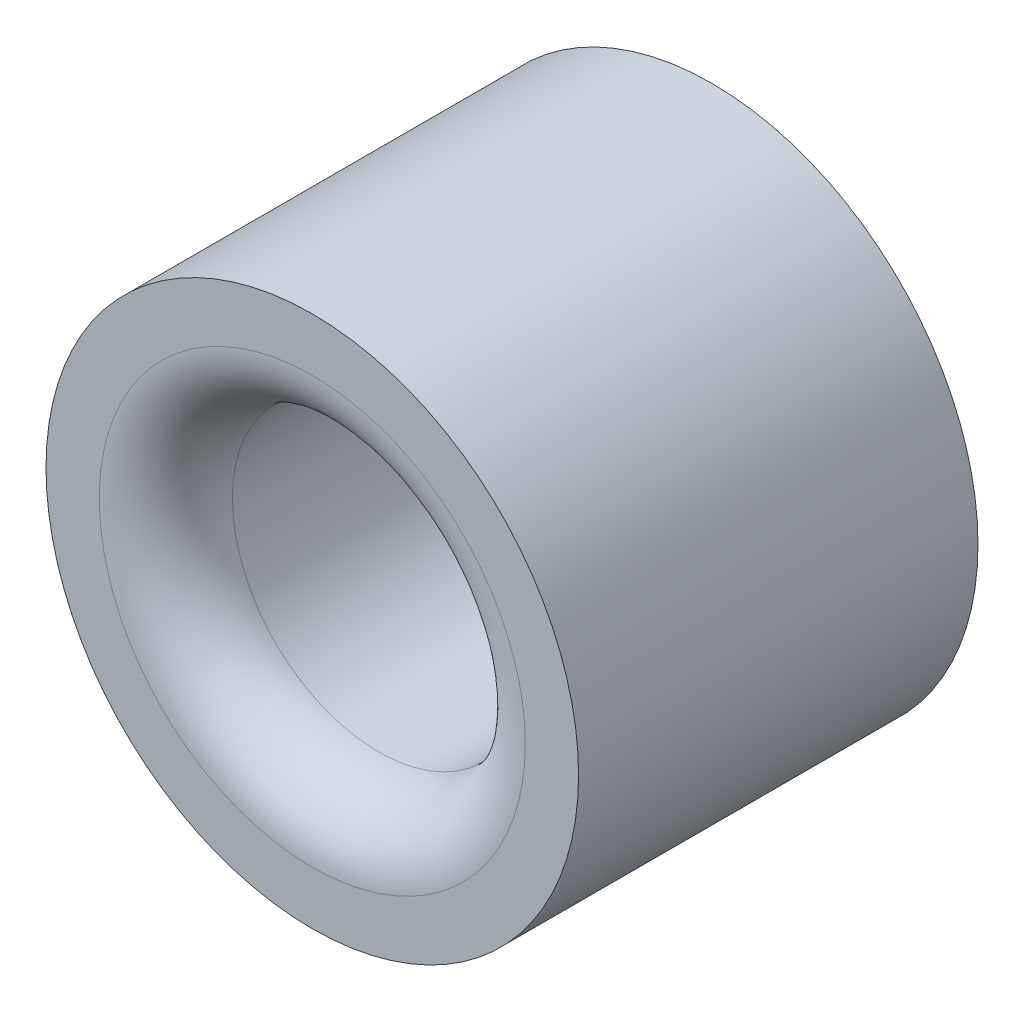
ISO-10303-21;
HEADER;
FILE_DESCRIPTION(('STEP AP214'),'2;1');
FILE_NAME('part.step','',(''),(''),'','','');
FILE_SCHEMA(('AUTOMOTIVE_DESIGN { 1 0 10303 214 1 1 1 1 }'));
ENDSEC;
DATA;
#1=APPLICATION_CONTEXT('core data for automotive mechanical design processes');
#2=APPLICATION_PROTOCOL_DEFINITION('international standard','automotive_design',2000,#1);
#3=PRODUCT_CONTEXT('',#1,'mechanical');
#4=PRODUCT('Part','Part','',(#3));
#5=PRODUCT_RELATED_PRODUCT_CATEGORY('part','',(#4));
#6=PRODUCT_DEFINITION_FORMATION('','',#4);
#7=PRODUCT_DEFINITION_CONTEXT('part definition',#1,'design');
#8=PRODUCT_DEFINITION('design','',#6,#7);
#9=PRODUCT_DEFINITION_SHAPE('','',#8);
#10=(LENGTH_UNIT() NAMED_UNIT(*) SI_UNIT(.MILLI.,.METRE.));
#11=(NAMED_UNIT(*) PLANE_ANGLE_UNIT() SI_UNIT($,.RADIAN.));
#12=(NAMED_UNIT(*) SI_UNIT($,.STERADIAN.) SOLID_ANGLE_UNIT());
#13=UNCERTAINTY_MEASURE_WITH_UNIT(LENGTH_MEASURE(1.E-05),#10,'distance_accuracy_value','');
#14=(GEOMETRIC_REPRESENTATION_CONTEXT(3) GLOBAL_UNCERTAINTY_ASSIGNED_CONTEXT((#13)) GLOBAL_UNIT_ASSIGNED_CONTEXT((#10,
#11,#12)) REPRESENTATION_CONTEXT('',''));
#15=CARTESIAN_POINT('',(0.,0.,0.));
#16=DIRECTION('',(0.,0.,1.));
#17=DIRECTION('',(1.,0.,0.));
#18=AXIS2_PLACEMENT_3D('',#15,#16,#17);
#19=CARTESIAN_POINT('',(0.,0.,3.));
#20=DIRECTION('',(0.,0.,1.));
#21=DIRECTION('',(1.,0.,0.));
#22=AXIS2_PLACEMENT_3D('',#19,#20,#21);
#23=PLANE('',#22);
#24=CARTESIAN_POINT('',(0.,0.,3.));
#25=DIRECTION('',(0.,0.,1.));
#26=DIRECTION('',(1.,0.,0.));
#27=AXIS2_PLACEMENT_3D('',#24,#25,#26);
#28=CIRCLE('',#27,1.6);
#29=CARTESIAN_POINT('',(1.6,0.,3.));
#30=VERTEX_POINT('',#29);
#31=EDGE_CURVE('E10',#30,#30,#28,.F.);
#32=ORIENTED_EDGE('',*,*,#31,.T.);
#33=EDGE_LOOP('',(#32));
#34=FACE_BOUND('',#33,.T.);
#35=CARTESIAN_POINT('',(0.,0.,3.));
#36=DIRECTION('',(0.,0.,1.));
#37=DIRECTION('',(1.,0.,0.));
#38=AXIS2_PLACEMENT_3D('',#35,#36,#37);
#39=CIRCLE('',#38,2.);
#40=CARTESIAN_POINT('',(2.,0.,3.));
#41=VERTEX_POINT('',#40);
#42=EDGE_CURVE('E52',#41,#41,#39,.T.);
#43=ORIENTED_EDGE('',*,*,#42,.T.);
#44=EDGE_LOOP('',(#43));
#45=FACE_BOUND('',#44,.T.);
#46=ADVANCED_FACE('F32',(#34,#45),#23,.T.);
#47=CARTESIAN_POINT('',(0.,0.,0.));
#48=DIRECTION('',(0.,0.,1.));
#49=DIRECTION('',(1.,0.,0.));
#50=AXIS2_PLACEMENT_3D('',#47,#48,#49);
#51=PLANE('',#50);
#52=CARTESIAN_POINT('',(0.,0.,0.));
#53=DIRECTION('',(0.,0.,1.));
#54=DIRECTION('',(1.,0.,0.));
#55=AXIS2_PLACEMENT_3D('',#52,#53,#54);
#56=CIRCLE('',#55,1.6);
#57=CARTESIAN_POINT('',(1.6,0.,0.));
#58=VERTEX_POINT('',#57);
#59=EDGE_CURVE('E47',#58,#58,#56,.T.);
#60=ORIENTED_EDGE('',*,*,#59,.T.);
#61=EDGE_LOOP('',(#60));
#62=FACE_BOUND('',#61,.T.);
#63=CARTESIAN_POINT('',(0.,0.,0.));
#64=DIRECTION('',(0.,0.,1.));
#65=DIRECTION('',(1.,0.,0.));
#66=AXIS2_PLACEMENT_3D('',#63,#64,#65);
#67=CIRCLE('',#66,2.);
#68=CARTESIAN_POINT('',(2.,0.,0.));
#69=VERTEX_POINT('',#68);
#70=EDGE_CURVE('E53',#69,#69,#67,.T.);
#71=ORIENTED_EDGE('',*,*,#70,.F.);
#72=EDGE_LOOP('',(#71));
#73=FACE_BOUND('',#72,.T.);
#74=ADVANCED_FACE('F64',(#62,#73),#51,.F.);
#75=CARTESIAN_POINT('',(0.,0.,3.));
#76=DIRECTION('',(0.,0.,-1.));
#77=DIRECTION('',(-1.,0.,0.));
#78=AXIS2_PLACEMENT_3D('',#75,#76,#77);
#79=CYLINDRICAL_SURFACE('',#78,2.);
#80=ORIENTED_EDGE('',*,*,#42,.F.);
#81=EDGE_LOOP('',(#80));
#82=FACE_BOUND('',#81,.T.);
#83=ORIENTED_EDGE('',*,*,#70,.T.);
#84=EDGE_LOOP('',(#83));
#85=FACE_BOUND('',#84,.T.);
#86=ADVANCED_FACE('F60',(#82,#85),#79,.T.);
#87=CARTESIAN_POINT('',(0.,0.,3.));
#88=DIRECTION('',(0.,0.,-1.));
#89=DIRECTION('',(-1.,0.,0.));
#90=AXIS2_PLACEMENT_3D('',#87,#88,#89);
#91=CYLINDRICAL_SURFACE('',#90,1.1);
#92=CARTESIAN_POINT('',(0.,0.,0.5));
#93=DIRECTION('',(0.,0.,1.));
#94=DIRECTION('',(1.,0.,0.));
#95=AXIS2_PLACEMENT_3D('',#92,#93,#94);
#96=CIRCLE('',#95,1.1);
#97=CARTESIAN_POINT('',(1.1,0.,0.5));
#98=VERTEX_POINT('',#97);
#99=EDGE_CURVE('E39',#98,#98,#96,.F.);
#100=ORIENTED_EDGE('',*,*,#99,.T.);
#101=EDGE_LOOP('',(#100));
#102=FACE_BOUND('',#101,.T.);
#103=CARTESIAN_POINT('',(0.,0.,2.5));
#104=DIRECTION('',(0.,0.,1.));
#105=DIRECTION('',(1.,0.,0.));
#106=AXIS2_PLACEMENT_3D('',#103,#104,#105);
#107=CIRCLE('',#106,1.1);
#108=CARTESIAN_POINT('',(1.1,0.,2.5));
#109=VERTEX_POINT('',#108);
#110=EDGE_CURVE('E43',#109,#109,#107,.T.);
#111=ORIENTED_EDGE('',*,*,#110,.T.);
#112=EDGE_LOOP('',(#111));
#113=FACE_BOUND('',#112,.T.);
#114=ADVANCED_FACE('F63',(#102,#113),#91,.F.);
#115=CARTESIAN_POINT('',(0.,0.,0.5));
#116=DIRECTION('',(0.,0.,1.));
#117=DIRECTION('',(1.,0.,0.));
#118=AXIS2_PLACEMENT_3D('',#115,#116,#117);
#119=TOROIDAL_SURFACE('',#118,1.6,0.5);
#120=ORIENTED_EDGE('',*,*,#99,.F.);
#121=EDGE_LOOP('',(#120));
#122=FACE_BOUND('',#121,.T.);
#123=ORIENTED_EDGE('',*,*,#59,.F.);
#124=EDGE_LOOP('',(#123));
#125=FACE_BOUND('',#124,.T.);
#126=ADVANCED_FACE('F76',(#122,#125),#119,.T.);
#127=CARTESIAN_POINT('',(0.,0.,2.5));
#128=DIRECTION('',(0.,0.,1.));
#129=DIRECTION('',(1.,0.,0.));
#130=AXIS2_PLACEMENT_3D('',#127,#128,#129);
#131=TOROIDAL_SURFACE('',#130,1.6,0.5);
#132=ORIENTED_EDGE('',*,*,#31,.F.);
#133=EDGE_LOOP('',(#132));
#134=FACE_BOUND('',#133,.T.);
#135=ORIENTED_EDGE('',*,*,#110,.F.);
#136=EDGE_LOOP('',(#135));
#137=FACE_BOUND('',#136,.T.);
#138=ADVANCED_FACE('F34',(#134,#137),#131,.T.);
#139=CLOSED_SHELL('',(#46,#74,#86,#114,#126,#138));
#140=MANIFOLD_SOLID_BREP('B2',#139);
#141=ADVANCED_BREP_SHAPE_REPRESENTATION('',(#18,#140),#14);
#142=SHAPE_DEFINITION_REPRESENTATION(#9,#141);
ENDSEC;
END-ISO-10303-21;
